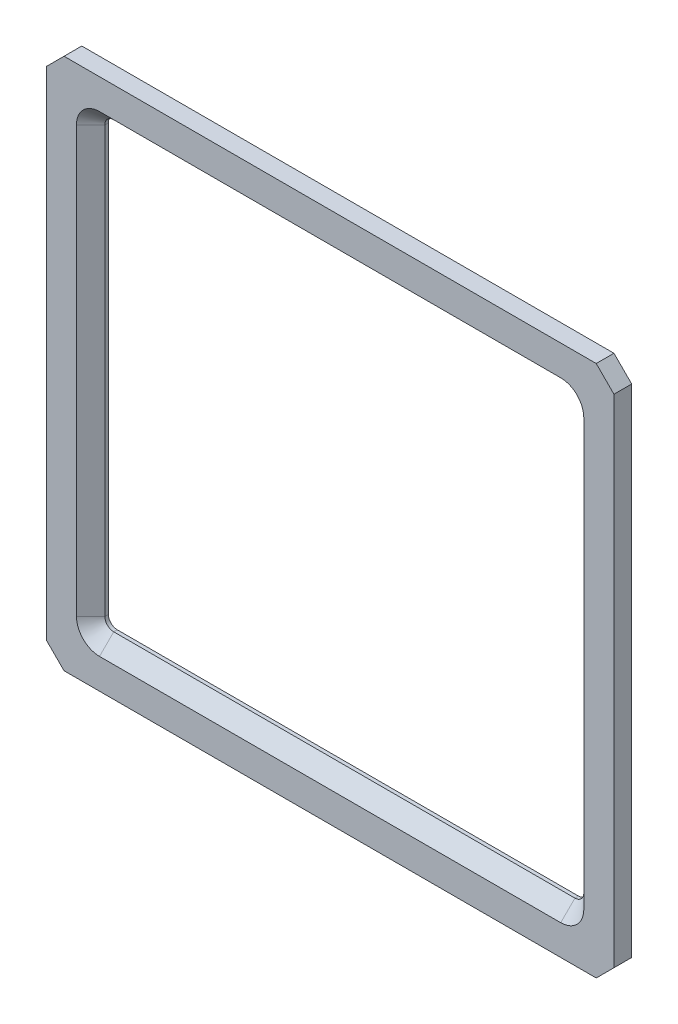
ISO-10303-21;
HEADER;
FILE_DESCRIPTION(('STEP AP214'),'2;1');
FILE_NAME('part.step','',(''),(''),'','','');
FILE_SCHEMA(('AUTOMOTIVE_DESIGN { 1 0 10303 214 1 1 1 1 }'));
ENDSEC;
DATA;
#1=APPLICATION_CONTEXT('core data for automotive mechanical design processes');
#2=APPLICATION_PROTOCOL_DEFINITION('international standard','automotive_design',2000,#1);
#3=PRODUCT_CONTEXT('',#1,'mechanical');
#4=PRODUCT('Part','Part','',(#3));
#5=PRODUCT_RELATED_PRODUCT_CATEGORY('part','',(#4));
#6=PRODUCT_DEFINITION_FORMATION('','',#4);
#7=PRODUCT_DEFINITION_CONTEXT('part definition',#1,'design');
#8=PRODUCT_DEFINITION('design','',#6,#7);
#9=PRODUCT_DEFINITION_SHAPE('','',#8);
#10=(LENGTH_UNIT() NAMED_UNIT(*) SI_UNIT(.MILLI.,.METRE.));
#11=(NAMED_UNIT(*) PLANE_ANGLE_UNIT() SI_UNIT($,.RADIAN.));
#12=(NAMED_UNIT(*) SI_UNIT($,.STERADIAN.) SOLID_ANGLE_UNIT());
#13=UNCERTAINTY_MEASURE_WITH_UNIT(LENGTH_MEASURE(1.E-05),#10,'distance_accuracy_value','');
#14=(GEOMETRIC_REPRESENTATION_CONTEXT(3) GLOBAL_UNCERTAINTY_ASSIGNED_CONTEXT((#13)) GLOBAL_UNIT_ASSIGNED_CONTEXT((#10,
#11,#12)) REPRESENTATION_CONTEXT('',''));
#15=CARTESIAN_POINT('',(0.,0.,0.));
#16=DIRECTION('',(0.,0.,1.));
#17=DIRECTION('',(1.,0.,0.));
#18=AXIS2_PLACEMENT_3D('',#15,#16,#17);
#19=CARTESIAN_POINT('',(160.,150.,10.));
#20=DIRECTION('',(-1.,0.,0.));
#21=DIRECTION('',(0.,-1.,0.));
#22=AXIS2_PLACEMENT_3D('',#19,#20,#21);
#23=PLANE('',#22);
#24=DIRECTION('',(0.,1.,0.));
#25=VECTOR('',#24,1.);
#26=CARTESIAN_POINT('',(160.,150.,10.));
#27=LINE('',#26,#25);
#28=CARTESIAN_POINT('',(160.,-140.,10.));
#29=VERTEX_POINT('',#28);
#30=CARTESIAN_POINT('',(160.,140.,10.));
#31=VERTEX_POINT('',#30);
#32=EDGE_CURVE('E221',#29,#31,#27,.T.);
#33=ORIENTED_EDGE('',*,*,#32,.F.);
#34=DIRECTION('',(0.,0.,-1.));
#35=VECTOR('',#34,1.);
#36=CARTESIAN_POINT('',(160.,-140.,10.));
#37=LINE('',#36,#35);
#38=CARTESIAN_POINT('',(160.,-140.,0.));
#39=VERTEX_POINT('',#38);
#40=EDGE_CURVE('E272',#29,#39,#37,.T.);
#41=ORIENTED_EDGE('',*,*,#40,.T.);
#42=DIRECTION('',(0.,1.,0.));
#43=VECTOR('',#42,1.);
#44=CARTESIAN_POINT('',(160.,150.,0.));
#45=LINE('',#44,#43);
#46=CARTESIAN_POINT('',(160.,140.,0.));
#47=VERTEX_POINT('',#46);
#48=EDGE_CURVE('E194',#39,#47,#45,.T.);
#49=ORIENTED_EDGE('',*,*,#48,.T.);
#50=DIRECTION('',(0.,0.,1.));
#51=VECTOR('',#50,1.);
#52=CARTESIAN_POINT('',(160.,140.,10.));
#53=LINE('',#52,#51);
#54=EDGE_CURVE('E270',#47,#31,#53,.T.);
#55=ORIENTED_EDGE('',*,*,#54,.T.);
#56=EDGE_LOOP('',(#33,#41,#49,#55));
#57=FACE_BOUND('',#56,.T.);
#58=ADVANCED_FACE('F35',(#57),#23,.F.);
#59=CARTESIAN_POINT('',(-160.,150.,10.));
#60=DIRECTION('',(0.,-1.,0.));
#61=DIRECTION('',(0.,0.,-1.));
#62=AXIS2_PLACEMENT_3D('',#59,#60,#61);
#63=PLANE('',#62);
#64=DIRECTION('',(-1.,0.,0.));
#65=VECTOR('',#64,1.);
#66=CARTESIAN_POINT('',(-160.,150.,0.));
#67=LINE('',#66,#65);
#68=CARTESIAN_POINT('',(150.,150.,0.));
#69=VERTEX_POINT('',#68);
#70=CARTESIAN_POINT('',(-150.,150.,0.));
#71=VERTEX_POINT('',#70);
#72=EDGE_CURVE('E237',#69,#71,#67,.T.);
#73=ORIENTED_EDGE('',*,*,#72,.T.);
#74=DIRECTION('',(0.,0.,1.));
#75=VECTOR('',#74,1.);
#76=CARTESIAN_POINT('',(-150.,150.,10.));
#77=LINE('',#76,#75);
#78=CARTESIAN_POINT('',(-150.,150.,10.));
#79=VERTEX_POINT('',#78);
#80=EDGE_CURVE('E278',#71,#79,#77,.T.);
#81=ORIENTED_EDGE('',*,*,#80,.T.);
#82=DIRECTION('',(-1.,0.,0.));
#83=VECTOR('',#82,1.);
#84=CARTESIAN_POINT('',(-160.,150.,10.));
#85=LINE('',#84,#83);
#86=CARTESIAN_POINT('',(150.,150.,10.));
#87=VERTEX_POINT('',#86);
#88=EDGE_CURVE('E224',#87,#79,#85,.T.);
#89=ORIENTED_EDGE('',*,*,#88,.F.);
#90=DIRECTION('',(0.,0.,-1.));
#91=VECTOR('',#90,1.);
#92=CARTESIAN_POINT('',(150.,150.,10.));
#93=LINE('',#92,#91);
#94=EDGE_CURVE('E275',#87,#69,#93,.T.);
#95=ORIENTED_EDGE('',*,*,#94,.T.);
#96=EDGE_LOOP('',(#73,#81,#89,#95));
#97=FACE_BOUND('',#96,.T.);
#98=ADVANCED_FACE('F396',(#97),#63,.F.);
#99=CARTESIAN_POINT('',(-160.,150.,10.));
#100=DIRECTION('',(1.,0.,0.));
#101=DIRECTION('',(0.,0.,-1.));
#102=AXIS2_PLACEMENT_3D('',#99,#100,#101);
#103=PLANE('',#102);
#104=DIRECTION('',(0.,-1.,0.));
#105=VECTOR('',#104,1.);
#106=CARTESIAN_POINT('',(-160.,150.,0.));
#107=LINE('',#106,#105);
#108=CARTESIAN_POINT('',(-160.,140.,0.));
#109=VERTEX_POINT('',#108);
#110=CARTESIAN_POINT('',(-160.,-140.,0.));
#111=VERTEX_POINT('',#110);
#112=EDGE_CURVE('E240',#109,#111,#107,.T.);
#113=ORIENTED_EDGE('',*,*,#112,.T.);
#114=DIRECTION('',(0.,0.,1.));
#115=VECTOR('',#114,1.);
#116=CARTESIAN_POINT('',(-160.,-140.,10.));
#117=LINE('',#116,#115);
#118=CARTESIAN_POINT('',(-160.,-140.,10.));
#119=VERTEX_POINT('',#118);
#120=EDGE_CURVE('E260',#111,#119,#117,.T.);
#121=ORIENTED_EDGE('',*,*,#120,.T.);
#122=DIRECTION('',(0.,-1.,0.));
#123=VECTOR('',#122,1.);
#124=CARTESIAN_POINT('',(-160.,150.,10.));
#125=LINE('',#124,#123);
#126=CARTESIAN_POINT('',(-160.,140.,10.));
#127=VERTEX_POINT('',#126);
#128=EDGE_CURVE('E228',#127,#119,#125,.T.);
#129=ORIENTED_EDGE('',*,*,#128,.F.);
#130=DIRECTION('',(0.,0.,-1.));
#131=VECTOR('',#130,1.);
#132=CARTESIAN_POINT('',(-160.,140.,10.));
#133=LINE('',#132,#131);
#134=EDGE_CURVE('E257',#127,#109,#133,.T.);
#135=ORIENTED_EDGE('',*,*,#134,.T.);
#136=EDGE_LOOP('',(#113,#121,#129,#135));
#137=FACE_BOUND('',#136,.T.);
#138=ADVANCED_FACE('F402',(#137),#103,.F.);
#139=CARTESIAN_POINT('',(-160.,-150.,10.));
#140=DIRECTION('',(0.,1.,0.));
#141=DIRECTION('',(0.,0.,1.));
#142=AXIS2_PLACEMENT_3D('',#139,#140,#141);
#143=PLANE('',#142);
#144=DIRECTION('',(1.,0.,0.));
#145=VECTOR('',#144,1.);
#146=CARTESIAN_POINT('',(-160.,-150.,10.));
#147=LINE('',#146,#145);
#148=CARTESIAN_POINT('',(-150.,-150.,10.));
#149=VERTEX_POINT('',#148);
#150=CARTESIAN_POINT('',(150.,-150.,10.));
#151=VERTEX_POINT('',#150);
#152=EDGE_CURVE('E231',#149,#151,#147,.T.);
#153=ORIENTED_EDGE('',*,*,#152,.F.);
#154=DIRECTION('',(0.,0.,-1.));
#155=VECTOR('',#154,1.);
#156=CARTESIAN_POINT('',(-150.,-150.,10.));
#157=LINE('',#156,#155);
#158=CARTESIAN_POINT('',(-150.,-150.,0.));
#159=VERTEX_POINT('',#158);
#160=EDGE_CURVE('E246',#149,#159,#157,.T.);
#161=ORIENTED_EDGE('',*,*,#160,.T.);
#162=DIRECTION('',(1.,0.,0.));
#163=VECTOR('',#162,1.);
#164=CARTESIAN_POINT('',(-160.,-150.,0.));
#165=LINE('',#164,#163);
#166=CARTESIAN_POINT('',(150.,-150.,0.));
#167=VERTEX_POINT('',#166);
#168=EDGE_CURVE('E225',#159,#167,#165,.T.);
#169=ORIENTED_EDGE('',*,*,#168,.T.);
#170=DIRECTION('',(0.,0.,1.));
#171=VECTOR('',#170,1.);
#172=CARTESIAN_POINT('',(150.,-150.,10.));
#173=LINE('',#172,#171);
#174=EDGE_CURVE('E234',#167,#151,#173,.T.);
#175=ORIENTED_EDGE('',*,*,#174,.T.);
#176=EDGE_LOOP('',(#153,#161,#169,#175));
#177=FACE_BOUND('',#176,.T.);
#178=ADVANCED_FACE('F567',(#177),#143,.F.);
#179=CARTESIAN_POINT('',(0.,0.,10.));
#180=DIRECTION('',(0.,0.,1.));
#181=DIRECTION('',(1.,0.,0.));
#182=AXIS2_PLACEMENT_3D('',#179,#180,#181);
#183=PLANE('',#182);
#184=CARTESIAN_POINT('',(130.,-120.,10.));
#185=DIRECTION('',(0.,0.,1.));
#186=DIRECTION('',(1.,0.,0.));
#187=AXIS2_PLACEMENT_3D('',#184,#185,#186);
#188=CIRCLE('',#187,13.0000000000001);
#189=CARTESIAN_POINT('',(143.,-120.,10.));
#190=VERTEX_POINT('',#189);
#191=CARTESIAN_POINT('',(130.,-133.,10.));
#192=VERTEX_POINT('',#191);
#193=EDGE_CURVE('E294',#190,#192,#188,.F.);
#194=ORIENTED_EDGE('',*,*,#193,.T.);
#195=DIRECTION('',(-1.,0.,0.));
#196=VECTOR('',#195,1.);
#197=CARTESIAN_POINT('',(-130.,-133.,10.));
#198=LINE('',#197,#196);
#199=CARTESIAN_POINT('',(-130.,-133.,10.));
#200=VERTEX_POINT('',#199);
#201=EDGE_CURVE('E296',#192,#200,#198,.T.);
#202=ORIENTED_EDGE('',*,*,#201,.T.);
#203=CARTESIAN_POINT('',(-130.,-120.,10.));
#204=DIRECTION('',(0.,0.,1.));
#205=DIRECTION('',(1.,0.,0.));
#206=AXIS2_PLACEMENT_3D('',#203,#204,#205);
#207=CIRCLE('',#206,13.0000000000001);
#208=CARTESIAN_POINT('',(-143.,-120.,10.));
#209=VERTEX_POINT('',#208);
#210=EDGE_CURVE('E292',#200,#209,#207,.F.);
#211=ORIENTED_EDGE('',*,*,#210,.T.);
#212=DIRECTION('',(0.,1.,0.));
#213=VECTOR('',#212,1.);
#214=CARTESIAN_POINT('',(-143.,120.,10.));
#215=LINE('',#214,#213);
#216=CARTESIAN_POINT('',(-143.,120.,10.));
#217=VERTEX_POINT('',#216);
#218=EDGE_CURVE('E288',#209,#217,#215,.T.);
#219=ORIENTED_EDGE('',*,*,#218,.T.);
#220=CARTESIAN_POINT('',(-130.,120.,10.));
#221=DIRECTION('',(0.,0.,1.));
#222=DIRECTION('',(1.,0.,0.));
#223=AXIS2_PLACEMENT_3D('',#220,#221,#222);
#224=CIRCLE('',#223,13.0000000000001);
#225=CARTESIAN_POINT('',(-130.,133.,10.));
#226=VERTEX_POINT('',#225);
#227=EDGE_CURVE('E284',#217,#226,#224,.F.);
#228=ORIENTED_EDGE('',*,*,#227,.T.);
#229=DIRECTION('',(1.,0.,0.));
#230=VECTOR('',#229,1.);
#231=CARTESIAN_POINT('',(130.,133.,10.));
#232=LINE('',#231,#230);
#233=CARTESIAN_POINT('',(130.,133.,10.));
#234=VERTEX_POINT('',#233);
#235=EDGE_CURVE('E282',#226,#234,#232,.T.);
#236=ORIENTED_EDGE('',*,*,#235,.T.);
#237=CARTESIAN_POINT('',(130.,120.,10.));
#238=DIRECTION('',(0.,0.,1.));
#239=DIRECTION('',(1.,0.,0.));
#240=AXIS2_PLACEMENT_3D('',#237,#238,#239);
#241=CIRCLE('',#240,13.0000000000002);
#242=CARTESIAN_POINT('',(143.,120.,10.));
#243=VERTEX_POINT('',#242);
#244=EDGE_CURVE('E286',#234,#243,#241,.F.);
#245=ORIENTED_EDGE('',*,*,#244,.T.);
#246=DIRECTION('',(0.,-1.,0.));
#247=VECTOR('',#246,1.);
#248=CARTESIAN_POINT('',(143.,-120.,10.));
#249=LINE('',#248,#247);
#250=EDGE_CURVE('E290',#243,#190,#249,.T.);
#251=ORIENTED_EDGE('',*,*,#250,.T.);
#252=EDGE_LOOP('',(#194,#202,#211,#219,#228,#236,#245,#251));
#253=FACE_BOUND('',#252,.T.);
#254=ORIENTED_EDGE('',*,*,#128,.T.);
#255=DIRECTION('',(-0.707106781186547,0.707106781186548,0.));
#256=VECTOR('',#255,1.);
#257=CARTESIAN_POINT('',(-150.,-150.,10.));
#258=LINE('',#257,#256);
#259=EDGE_CURVE('E268',#119,#149,#258,.F.);
#260=ORIENTED_EDGE('',*,*,#259,.T.);
#261=ORIENTED_EDGE('',*,*,#152,.T.);
#262=DIRECTION('',(-0.707106781186549,-0.707106781186547,0.));
#263=VECTOR('',#262,1.);
#264=CARTESIAN_POINT('',(150.,-150.,10.));
#265=LINE('',#264,#263);
#266=EDGE_CURVE('E266',#151,#29,#265,.F.);
#267=ORIENTED_EDGE('',*,*,#266,.T.);
#268=ORIENTED_EDGE('',*,*,#32,.T.);
#269=DIRECTION('',(0.707106781186546,-0.707106781186549,0.));
#270=VECTOR('',#269,1.);
#271=CARTESIAN_POINT('',(150.,150.,10.));
#272=LINE('',#271,#270);
#273=EDGE_CURVE('E262',#31,#87,#272,.F.);
#274=ORIENTED_EDGE('',*,*,#273,.T.);
#275=ORIENTED_EDGE('',*,*,#88,.T.);
#276=DIRECTION('',(0.707106781186549,0.707106781186546,0.));
#277=VECTOR('',#276,1.);
#278=CARTESIAN_POINT('',(-150.,150.,10.));
#279=LINE('',#278,#277);
#280=EDGE_CURVE('E264',#79,#127,#279,.F.);
#281=ORIENTED_EDGE('',*,*,#280,.T.);
#282=EDGE_LOOP('',(#254,#260,#261,#267,#268,#274,#275,#281));
#283=FACE_BOUND('',#282,.T.);
#284=ADVANCED_FACE('F385',(#253,#283),#183,.T.);
#285=CARTESIAN_POINT('',(0.,0.,0.));
#286=DIRECTION('',(0.,0.,1.));
#287=DIRECTION('',(1.,0.,0.));
#288=AXIS2_PLACEMENT_3D('',#285,#286,#287);
#289=PLANE('',#288);
#290=DIRECTION('',(0.,1.,0.));
#291=VECTOR('',#290,1.);
#292=CARTESIAN_POINT('',(-135.,120.,0.));
#293=LINE('',#292,#291);
#294=CARTESIAN_POINT('',(-135.,-120.,0.));
#295=VERTEX_POINT('',#294);
#296=CARTESIAN_POINT('',(-135.,120.,0.));
#297=VERTEX_POINT('',#296);
#298=EDGE_CURVE('E201',#295,#297,#293,.T.);
#299=ORIENTED_EDGE('',*,*,#298,.F.);
#300=CARTESIAN_POINT('',(-130.,-120.,0.));
#301=DIRECTION('',(0.,0.,1.));
#302=DIRECTION('',(1.,0.,0.));
#303=AXIS2_PLACEMENT_3D('',#300,#301,#302);
#304=CIRCLE('',#303,5.);
#305=CARTESIAN_POINT('',(-130.,-125.,0.));
#306=VERTEX_POINT('',#305);
#307=EDGE_CURVE('E178',#306,#295,#304,.F.);
#308=ORIENTED_EDGE('',*,*,#307,.F.);
#309=DIRECTION('',(-1.,0.,0.));
#310=VECTOR('',#309,1.);
#311=CARTESIAN_POINT('',(-130.,-125.,0.));
#312=LINE('',#311,#310);
#313=CARTESIAN_POINT('',(130.,-125.,0.));
#314=VERTEX_POINT('',#313);
#315=EDGE_CURVE('E189',#314,#306,#312,.T.);
#316=ORIENTED_EDGE('',*,*,#315,.F.);
#317=CARTESIAN_POINT('',(130.,-120.,0.));
#318=DIRECTION('',(0.,0.,1.));
#319=DIRECTION('',(1.,0.,0.));
#320=AXIS2_PLACEMENT_3D('',#317,#318,#319);
#321=CIRCLE('',#320,5.);
#322=CARTESIAN_POINT('',(135.,-120.,0.));
#323=VERTEX_POINT('',#322);
#324=EDGE_CURVE('E329',#323,#314,#321,.F.);
#325=ORIENTED_EDGE('',*,*,#324,.F.);
#326=DIRECTION('',(0.,-1.,0.));
#327=VECTOR('',#326,1.);
#328=CARTESIAN_POINT('',(135.,120.,0.));
#329=LINE('',#328,#327);
#330=CARTESIAN_POINT('',(135.,120.,0.));
#331=VERTEX_POINT('',#330);
#332=EDGE_CURVE('E334',#331,#323,#329,.T.);
#333=ORIENTED_EDGE('',*,*,#332,.F.);
#334=CARTESIAN_POINT('',(130.,120.,0.));
#335=DIRECTION('',(0.,0.,1.));
#336=DIRECTION('',(1.,0.,0.));
#337=AXIS2_PLACEMENT_3D('',#334,#335,#336);
#338=CIRCLE('',#337,5.);
#339=CARTESIAN_POINT('',(130.,125.,0.));
#340=VERTEX_POINT('',#339);
#341=EDGE_CURVE('E338',#340,#331,#338,.F.);
#342=ORIENTED_EDGE('',*,*,#341,.F.);
#343=DIRECTION('',(1.,0.,0.));
#344=VECTOR('',#343,1.);
#345=CARTESIAN_POINT('',(-130.,125.,0.));
#346=LINE('',#345,#344);
#347=CARTESIAN_POINT('',(-130.,125.,0.));
#348=VERTEX_POINT('',#347);
#349=EDGE_CURVE('E343',#348,#340,#346,.T.);
#350=ORIENTED_EDGE('',*,*,#349,.F.);
#351=CARTESIAN_POINT('',(-130.,120.,0.));
#352=DIRECTION('',(0.,0.,1.));
#353=DIRECTION('',(1.,0.,0.));
#354=AXIS2_PLACEMENT_3D('',#351,#352,#353);
#355=CIRCLE('',#354,5.);
#356=EDGE_CURVE('E203',#297,#348,#355,.F.);
#357=ORIENTED_EDGE('',*,*,#356,.F.);
#358=EDGE_LOOP('',(#299,#308,#316,#325,#333,#342,#350,#357));
#359=FACE_BOUND('',#358,.T.);
#360=ORIENTED_EDGE('',*,*,#168,.F.);
#361=DIRECTION('',(0.707106781186547,-0.707106781186548,0.));
#362=VECTOR('',#361,1.);
#363=CARTESIAN_POINT('',(-150.,-150.,0.));
#364=LINE('',#363,#362);
#365=EDGE_CURVE('E255',#159,#111,#364,.F.);
#366=ORIENTED_EDGE('',*,*,#365,.T.);
#367=ORIENTED_EDGE('',*,*,#112,.F.);
#368=DIRECTION('',(-0.707106781186549,-0.707106781186546,0.));
#369=VECTOR('',#368,1.);
#370=CARTESIAN_POINT('',(-160.,140.,0.));
#371=LINE('',#370,#369);
#372=EDGE_CURVE('E251',#109,#71,#371,.F.);
#373=ORIENTED_EDGE('',*,*,#372,.T.);
#374=ORIENTED_EDGE('',*,*,#72,.F.);
#375=DIRECTION('',(-0.707106781186546,0.707106781186549,0.));
#376=VECTOR('',#375,1.);
#377=CARTESIAN_POINT('',(150.,150.,0.));
#378=LINE('',#377,#376);
#379=EDGE_CURVE('E249',#69,#47,#378,.F.);
#380=ORIENTED_EDGE('',*,*,#379,.T.);
#381=ORIENTED_EDGE('',*,*,#48,.F.);
#382=DIRECTION('',(0.707106781186549,0.707106781186547,0.));
#383=VECTOR('',#382,1.);
#384=CARTESIAN_POINT('',(160.,-140.,0.));
#385=LINE('',#384,#383);
#386=EDGE_CURVE('E253',#39,#167,#385,.F.);
#387=ORIENTED_EDGE('',*,*,#386,.T.);
#388=EDGE_LOOP('',(#360,#366,#367,#373,#374,#380,#381,#387));
#389=FACE_BOUND('',#388,.T.);
#390=ADVANCED_FACE('F197',(#359,#389),#289,.F.);
#391=CARTESIAN_POINT('',(-150.,-150.,10.));
#392=DIRECTION('',(0.707106781186548,0.707106781186547,0.));
#393=DIRECTION('',(0.,0.,-1.));
#394=AXIS2_PLACEMENT_3D('',#391,#392,#393);
#395=PLANE('',#394);
#396=ORIENTED_EDGE('',*,*,#259,.F.);
#397=ORIENTED_EDGE('',*,*,#120,.F.);
#398=ORIENTED_EDGE('',*,*,#365,.F.);
#399=ORIENTED_EDGE('',*,*,#160,.F.);
#400=EDGE_LOOP('',(#396,#397,#398,#399));
#401=FACE_BOUND('',#400,.T.);
#402=ADVANCED_FACE('F408',(#401),#395,.F.);
#403=CARTESIAN_POINT('',(160.,-140.,10.));
#404=DIRECTION('',(-0.707106781186546,0.707106781186548,0.));
#405=DIRECTION('',(0.,0.,-1.));
#406=AXIS2_PLACEMENT_3D('',#403,#404,#405);
#407=PLANE('',#406);
#408=ORIENTED_EDGE('',*,*,#266,.F.);
#409=ORIENTED_EDGE('',*,*,#174,.F.);
#410=ORIENTED_EDGE('',*,*,#386,.F.);
#411=ORIENTED_EDGE('',*,*,#40,.F.);
#412=EDGE_LOOP('',(#408,#409,#410,#411));
#413=FACE_BOUND('',#412,.T.);
#414=ADVANCED_FACE('F411',(#413),#407,.F.);
#415=CARTESIAN_POINT('',(-160.,140.,10.));
#416=DIRECTION('',(0.707106781186546,-0.707106781186549,0.));
#417=DIRECTION('',(0.,0.,-1.));
#418=AXIS2_PLACEMENT_3D('',#415,#416,#417);
#419=PLANE('',#418);
#420=ORIENTED_EDGE('',*,*,#280,.F.);
#421=ORIENTED_EDGE('',*,*,#80,.F.);
#422=ORIENTED_EDGE('',*,*,#372,.F.);
#423=ORIENTED_EDGE('',*,*,#134,.F.);
#424=EDGE_LOOP('',(#420,#421,#422,#423));
#425=FACE_BOUND('',#424,.T.);
#426=ADVANCED_FACE('F415',(#425),#419,.F.);
#427=CARTESIAN_POINT('',(150.,150.,10.));
#428=DIRECTION('',(-0.707106781186549,-0.707106781186545,0.));
#429=DIRECTION('',(0.,0.,-1.));
#430=AXIS2_PLACEMENT_3D('',#427,#428,#429);
#431=PLANE('',#430);
#432=ORIENTED_EDGE('',*,*,#273,.F.);
#433=ORIENTED_EDGE('',*,*,#54,.F.);
#434=ORIENTED_EDGE('',*,*,#379,.F.);
#435=ORIENTED_EDGE('',*,*,#94,.F.);
#436=EDGE_LOOP('',(#432,#433,#434,#435));
#437=FACE_BOUND('',#436,.T.);
#438=ADVANCED_FACE('F419',(#437),#431,.F.);
#439=CARTESIAN_POINT('',(-130.,-120.,-0.000999999999999265));
#440=DIRECTION('',(0.,0.,1.));
#441=DIRECTION('',(1.,0.,0.));
#442=AXIS2_PLACEMENT_3D('',#439,#440,#441);
#443=CYLINDRICAL_SURFACE('',#442,5.);
#444=DIRECTION('',(0.,0.,1.));
#445=VECTOR('',#444,1.);
#446=CARTESIAN_POINT('',(-135.,-120.,-0.000999999999999265));
#447=LINE('',#446,#445);
#448=CARTESIAN_POINT('',(-135.,-120.,1.99999999999994));
#449=VERTEX_POINT('',#448);
#450=EDGE_CURVE('E195',#295,#449,#447,.T.);
#451=ORIENTED_EDGE('',*,*,#450,.T.);
#452=CARTESIAN_POINT('',(-130.,-120.,1.99999999999994));
#453=DIRECTION('',(0.,0.,1.));
#454=DIRECTION('',(1.,0.,0.));
#455=AXIS2_PLACEMENT_3D('',#452,#453,#454);
#456=CIRCLE('',#455,5.);
#457=CARTESIAN_POINT('',(-130.,-125.,1.99999999999994));
#458=VERTEX_POINT('',#457);
#459=EDGE_CURVE('E181',#449,#458,#456,.T.);
#460=ORIENTED_EDGE('',*,*,#459,.T.);
#461=DIRECTION('',(0.,0.,1.));
#462=VECTOR('',#461,1.);
#463=CARTESIAN_POINT('',(-130.,-125.,-0.000999999999999265));
#464=LINE('',#463,#462);
#465=EDGE_CURVE('E173',#306,#458,#464,.T.);
#466=ORIENTED_EDGE('',*,*,#465,.F.);
#467=ORIENTED_EDGE('',*,*,#307,.T.);
#468=EDGE_LOOP('',(#451,#460,#466,#467));
#469=FACE_BOUND('',#468,.T.);
#470=ADVANCED_FACE('F176',(#469),#443,.F.);
#471=CARTESIAN_POINT('',(-135.,120.,-0.000999999999999265));
#472=DIRECTION('',(-1.,0.,0.));
#473=DIRECTION('',(0.,-1.,0.));
#474=AXIS2_PLACEMENT_3D('',#471,#472,#473);
#475=PLANE('',#474);
#476=DIRECTION('',(0.,0.,1.));
#477=VECTOR('',#476,1.);
#478=CARTESIAN_POINT('',(-135.,120.,-0.000999999999999265));
#479=LINE('',#478,#477);
#480=CARTESIAN_POINT('',(-135.,120.,1.99999999999994));
#481=VERTEX_POINT('',#480);
#482=EDGE_CURVE('E208',#297,#481,#479,.T.);
#483=ORIENTED_EDGE('',*,*,#482,.T.);
#484=DIRECTION('',(0.,-1.,0.));
#485=VECTOR('',#484,1.);
#486=CARTESIAN_POINT('',(-135.,-120.,1.99999999999994));
#487=LINE('',#486,#485);
#488=EDGE_CURVE('E304',#481,#449,#487,.T.);
#489=ORIENTED_EDGE('',*,*,#488,.T.);
#490=ORIENTED_EDGE('',*,*,#450,.F.);
#491=ORIENTED_EDGE('',*,*,#298,.T.);
#492=EDGE_LOOP('',(#483,#489,#490,#491));
#493=FACE_BOUND('',#492,.T.);
#494=ADVANCED_FACE('F358',(#493),#475,.F.);
#495=CARTESIAN_POINT('',(-130.,120.,-0.000999999999999265));
#496=DIRECTION('',(0.,0.,1.));
#497=DIRECTION('',(1.,0.,0.));
#498=AXIS2_PLACEMENT_3D('',#495,#496,#497);
#499=CYLINDRICAL_SURFACE('',#498,5.);
#500=DIRECTION('',(0.,0.,1.));
#501=VECTOR('',#500,1.);
#502=CARTESIAN_POINT('',(-130.,125.,-0.000999999999999265));
#503=LINE('',#502,#501);
#504=CARTESIAN_POINT('',(-130.,125.,1.99999999999994));
#505=VERTEX_POINT('',#504);
#506=EDGE_CURVE('E211',#348,#505,#503,.T.);
#507=ORIENTED_EDGE('',*,*,#506,.T.);
#508=CARTESIAN_POINT('',(-130.,120.,1.99999999999994));
#509=DIRECTION('',(0.,0.,1.));
#510=DIRECTION('',(1.,0.,0.));
#511=AXIS2_PLACEMENT_3D('',#508,#509,#510);
#512=CIRCLE('',#511,5.);
#513=EDGE_CURVE('E44',#505,#481,#512,.T.);
#514=ORIENTED_EDGE('',*,*,#513,.T.);
#515=ORIENTED_EDGE('',*,*,#482,.F.);
#516=ORIENTED_EDGE('',*,*,#356,.T.);
#517=EDGE_LOOP('',(#507,#514,#515,#516));
#518=FACE_BOUND('',#517,.T.);
#519=ADVANCED_FACE('F348',(#518),#499,.F.);
#520=CARTESIAN_POINT('',(-130.,125.,-0.000999999999999265));
#521=DIRECTION('',(0.,1.,0.));
#522=DIRECTION('',(0.,0.,1.));
#523=AXIS2_PLACEMENT_3D('',#520,#521,#522);
#524=PLANE('',#523);
#525=DIRECTION('',(0.,0.,1.));
#526=VECTOR('',#525,1.);
#527=CARTESIAN_POINT('',(130.,125.,-0.000999999999999265));
#528=LINE('',#527,#526);
#529=CARTESIAN_POINT('',(130.,125.,1.99999999999994));
#530=VERTEX_POINT('',#529);
#531=EDGE_CURVE('E213',#340,#530,#528,.T.);
#532=ORIENTED_EDGE('',*,*,#531,.T.);
#533=DIRECTION('',(-1.,0.,0.));
#534=VECTOR('',#533,1.);
#535=CARTESIAN_POINT('',(-130.,125.,1.99999999999994));
#536=LINE('',#535,#534);
#537=EDGE_CURVE('E11',#530,#505,#536,.T.);
#538=ORIENTED_EDGE('',*,*,#537,.T.);
#539=ORIENTED_EDGE('',*,*,#506,.F.);
#540=ORIENTED_EDGE('',*,*,#349,.T.);
#541=EDGE_LOOP('',(#532,#538,#539,#540));
#542=FACE_BOUND('',#541,.T.);
#543=ADVANCED_FACE('F351',(#542),#524,.F.);
#544=CARTESIAN_POINT('',(130.,120.,-0.000999999999999265));
#545=DIRECTION('',(0.,0.,1.));
#546=DIRECTION('',(1.,0.,0.));
#547=AXIS2_PLACEMENT_3D('',#544,#545,#546);
#548=CYLINDRICAL_SURFACE('',#547,5.);
#549=DIRECTION('',(0.,0.,1.));
#550=VECTOR('',#549,1.);
#551=CARTESIAN_POINT('',(135.,120.,-0.000999999999999265));
#552=LINE('',#551,#550);
#553=CARTESIAN_POINT('',(135.,120.,1.99999999999994));
#554=VERTEX_POINT('',#553);
#555=EDGE_CURVE('E215',#331,#554,#552,.T.);
#556=ORIENTED_EDGE('',*,*,#555,.T.);
#557=CARTESIAN_POINT('',(130.,120.,1.99999999999994));
#558=DIRECTION('',(0.,0.,1.));
#559=DIRECTION('',(1.,0.,0.));
#560=AXIS2_PLACEMENT_3D('',#557,#558,#559);
#561=CIRCLE('',#560,5.);
#562=EDGE_CURVE('E58',#554,#530,#561,.T.);
#563=ORIENTED_EDGE('',*,*,#562,.T.);
#564=ORIENTED_EDGE('',*,*,#531,.F.);
#565=ORIENTED_EDGE('',*,*,#341,.T.);
#566=EDGE_LOOP('',(#556,#563,#564,#565));
#567=FACE_BOUND('',#566,.T.);
#568=ADVANCED_FACE('F496',(#567),#548,.F.);
#569=CARTESIAN_POINT('',(135.,120.,-0.000999999999999265));
#570=DIRECTION('',(1.,0.,0.));
#571=DIRECTION('',(0.,1.,0.));
#572=AXIS2_PLACEMENT_3D('',#569,#570,#571);
#573=PLANE('',#572);
#574=DIRECTION('',(0.,0.,1.));
#575=VECTOR('',#574,1.);
#576=CARTESIAN_POINT('',(135.,-120.,-0.000999999999999265));
#577=LINE('',#576,#575);
#578=CARTESIAN_POINT('',(135.,-120.,1.99999999999994));
#579=VERTEX_POINT('',#578);
#580=EDGE_CURVE('E217',#323,#579,#577,.T.);
#581=ORIENTED_EDGE('',*,*,#580,.T.);
#582=DIRECTION('',(0.,1.,0.));
#583=VECTOR('',#582,1.);
#584=CARTESIAN_POINT('',(135.,120.,1.99999999999994));
#585=LINE('',#584,#583);
#586=EDGE_CURVE('E302',#579,#554,#585,.T.);
#587=ORIENTED_EDGE('',*,*,#586,.T.);
#588=ORIENTED_EDGE('',*,*,#555,.F.);
#589=ORIENTED_EDGE('',*,*,#332,.T.);
#590=EDGE_LOOP('',(#581,#587,#588,#589));
#591=FACE_BOUND('',#590,.T.);
#592=ADVANCED_FACE('F376',(#591),#573,.F.);
#593=CARTESIAN_POINT('',(130.,-120.,-0.000999999999999265));
#594=DIRECTION('',(0.,0.,1.));
#595=DIRECTION('',(1.,0.,0.));
#596=AXIS2_PLACEMENT_3D('',#593,#594,#595);
#597=CYLINDRICAL_SURFACE('',#596,5.);
#598=DIRECTION('',(0.,0.,1.));
#599=VECTOR('',#598,1.);
#600=CARTESIAN_POINT('',(130.,-125.,-0.000999999999999265));
#601=LINE('',#600,#599);
#602=CARTESIAN_POINT('',(130.,-125.,1.99999999999994));
#603=VERTEX_POINT('',#602);
#604=EDGE_CURVE('E185',#314,#603,#601,.T.);
#605=ORIENTED_EDGE('',*,*,#604,.T.);
#606=CARTESIAN_POINT('',(130.,-120.,1.99999999999994));
#607=DIRECTION('',(0.,0.,1.));
#608=DIRECTION('',(1.,0.,0.));
#609=AXIS2_PLACEMENT_3D('',#606,#607,#608);
#610=CIRCLE('',#609,5.);
#611=EDGE_CURVE('E299',#603,#579,#610,.T.);
#612=ORIENTED_EDGE('',*,*,#611,.T.);
#613=ORIENTED_EDGE('',*,*,#580,.F.);
#614=ORIENTED_EDGE('',*,*,#324,.T.);
#615=EDGE_LOOP('',(#605,#612,#613,#614));
#616=FACE_BOUND('',#615,.T.);
#617=ADVANCED_FACE('F372',(#616),#597,.F.);
#618=CARTESIAN_POINT('',(-130.,-125.,-0.000999999999999265));
#619=DIRECTION('',(0.,-1.,0.));
#620=DIRECTION('',(0.,0.,-1.));
#621=AXIS2_PLACEMENT_3D('',#618,#619,#620);
#622=PLANE('',#621);
#623=ORIENTED_EDGE('',*,*,#465,.T.);
#624=DIRECTION('',(1.,0.,0.));
#625=VECTOR('',#624,1.);
#626=CARTESIAN_POINT('',(130.,-125.,1.99999999999994));
#627=LINE('',#626,#625);
#628=EDGE_CURVE('E280',#458,#603,#627,.T.);
#629=ORIENTED_EDGE('',*,*,#628,.T.);
#630=ORIENTED_EDGE('',*,*,#604,.F.);
#631=ORIENTED_EDGE('',*,*,#315,.T.);
#632=EDGE_LOOP('',(#623,#629,#630,#631));
#633=FACE_BOUND('',#632,.T.);
#634=ADVANCED_FACE('F190',(#633),#622,.F.);
#635=CARTESIAN_POINT('',(-130.,125.,1.99999999999994));
#636=DIRECTION('',(0.,-0.707106781186545,0.707106781186551));
#637=DIRECTION('',(1.,0.,0.));
#638=AXIS2_PLACEMENT_3D('',#635,#636,#637);
#639=PLANE('',#638);
#640=DIRECTION('',(0.,-0.707106781186551,-0.707106781186545));
#641=VECTOR('',#640,1.);
#642=CARTESIAN_POINT('',(130.,133.,10.));
#643=LINE('',#642,#641);
#644=EDGE_CURVE('E323',#234,#530,#643,.T.);
#645=ORIENTED_EDGE('',*,*,#644,.F.);
#646=ORIENTED_EDGE('',*,*,#235,.F.);
#647=DIRECTION('',(0.,0.707106781186551,0.707106781186545));
#648=VECTOR('',#647,1.);
#649=CARTESIAN_POINT('',(-130.,125.,1.99999999999994));
#650=LINE('',#649,#648);
#651=EDGE_CURVE('E39',#505,#226,#650,.T.);
#652=ORIENTED_EDGE('',*,*,#651,.F.);
#653=ORIENTED_EDGE('',*,*,#537,.F.);
#654=EDGE_LOOP('',(#645,#646,#652,#653));
#655=FACE_BOUND('',#654,.T.);
#656=ADVANCED_FACE('F37',(#655),#639,.T.);
#657=CARTESIAN_POINT('',(-130.,120.,1.99999999999994));
#658=DIRECTION('',(0.,0.,1.));
#659=DIRECTION('',(1.,0.,0.));
#660=AXIS2_PLACEMENT_3D('',#657,#658,#659);
#661=CONICAL_SURFACE('',#660,5.,0.785398163397452);
#662=ORIENTED_EDGE('',*,*,#651,.T.);
#663=ORIENTED_EDGE('',*,*,#227,.F.);
#664=DIRECTION('',(-0.70710678118655,0.,0.707106781186545));
#665=VECTOR('',#664,1.);
#666=CARTESIAN_POINT('',(-135.,120.,1.99999999999994));
#667=LINE('',#666,#665);
#668=EDGE_CURVE('E321',#481,#217,#667,.T.);
#669=ORIENTED_EDGE('',*,*,#668,.F.);
#670=ORIENTED_EDGE('',*,*,#513,.F.);
#671=EDGE_LOOP('',(#662,#663,#669,#670));
#672=FACE_BOUND('',#671,.T.);
#673=ADVANCED_FACE('F355',(#672),#661,.F.);
#674=CARTESIAN_POINT('',(130.,120.,1.99999999999994));
#675=DIRECTION('',(0.,0.,1.));
#676=DIRECTION('',(1.,0.,0.));
#677=AXIS2_PLACEMENT_3D('',#674,#675,#676);
#678=CONICAL_SURFACE('',#677,5.,0.785398163397453);
#679=ORIENTED_EDGE('',*,*,#644,.T.);
#680=ORIENTED_EDGE('',*,*,#562,.F.);
#681=DIRECTION('',(-0.707106781186551,0.,-0.707106781186544));
#682=VECTOR('',#681,1.);
#683=CARTESIAN_POINT('',(143.,120.,10.));
#684=LINE('',#683,#682);
#685=EDGE_CURVE('E318',#243,#554,#684,.T.);
#686=ORIENTED_EDGE('',*,*,#685,.F.);
#687=ORIENTED_EDGE('',*,*,#244,.F.);
#688=EDGE_LOOP('',(#679,#680,#686,#687));
#689=FACE_BOUND('',#688,.T.);
#690=ADVANCED_FACE('F387',(#689),#678,.F.);
#691=CARTESIAN_POINT('',(-135.,120.,1.99999999999994));
#692=DIRECTION('',(0.707106781186545,0.,0.707106781186551));
#693=DIRECTION('',(0.,1.,0.));
#694=AXIS2_PLACEMENT_3D('',#691,#692,#693);
#695=PLANE('',#694);
#696=ORIENTED_EDGE('',*,*,#668,.T.);
#697=ORIENTED_EDGE('',*,*,#218,.F.);
#698=DIRECTION('',(-0.70710678118655,0.,0.707106781186545));
#699=VECTOR('',#698,1.);
#700=CARTESIAN_POINT('',(-135.,-120.,1.99999999999994));
#701=LINE('',#700,#699);
#702=EDGE_CURVE('E315',#449,#209,#701,.T.);
#703=ORIENTED_EDGE('',*,*,#702,.F.);
#704=ORIENTED_EDGE('',*,*,#488,.F.);
#705=EDGE_LOOP('',(#696,#697,#703,#704));
#706=FACE_BOUND('',#705,.T.);
#707=ADVANCED_FACE('F362',(#706),#695,.T.);
#708=CARTESIAN_POINT('',(135.,120.,1.99999999999994));
#709=DIRECTION('',(-0.707106781186545,0.,0.70710678118655));
#710=DIRECTION('',(0.,-1.,0.));
#711=AXIS2_PLACEMENT_3D('',#708,#709,#710);
#712=PLANE('',#711);
#713=ORIENTED_EDGE('',*,*,#685,.T.);
#714=ORIENTED_EDGE('',*,*,#586,.F.);
#715=DIRECTION('',(-0.70710678118655,0.,-0.707106781186545));
#716=VECTOR('',#715,1.);
#717=CARTESIAN_POINT('',(143.,-120.,10.));
#718=LINE('',#717,#716);
#719=EDGE_CURVE('E312',#190,#579,#718,.T.);
#720=ORIENTED_EDGE('',*,*,#719,.F.);
#721=ORIENTED_EDGE('',*,*,#250,.F.);
#722=EDGE_LOOP('',(#713,#714,#720,#721));
#723=FACE_BOUND('',#722,.T.);
#724=ADVANCED_FACE('F379',(#723),#712,.T.);
#725=CARTESIAN_POINT('',(-130.,-120.,1.99999999999994));
#726=DIRECTION('',(0.,0.,1.));
#727=DIRECTION('',(1.,0.,0.));
#728=AXIS2_PLACEMENT_3D('',#725,#726,#727);
#729=CONICAL_SURFACE('',#728,5.,0.785398163397452);
#730=ORIENTED_EDGE('',*,*,#702,.T.);
#731=ORIENTED_EDGE('',*,*,#210,.F.);
#732=DIRECTION('',(0.,-0.70710678118655,0.707106781186545));
#733=VECTOR('',#732,1.);
#734=CARTESIAN_POINT('',(-130.,-125.,1.99999999999994));
#735=LINE('',#734,#733);
#736=EDGE_CURVE('E310',#458,#200,#735,.T.);
#737=ORIENTED_EDGE('',*,*,#736,.F.);
#738=ORIENTED_EDGE('',*,*,#459,.F.);
#739=EDGE_LOOP('',(#730,#731,#737,#738));
#740=FACE_BOUND('',#739,.T.);
#741=ADVANCED_FACE('F365',(#740),#729,.F.);
#742=CARTESIAN_POINT('',(130.,-120.,1.99999999999994));
#743=DIRECTION('',(0.,0.,1.));
#744=DIRECTION('',(1.,0.,0.));
#745=AXIS2_PLACEMENT_3D('',#742,#743,#744);
#746=CONICAL_SURFACE('',#745,5.,0.785398163397452);
#747=ORIENTED_EDGE('',*,*,#719,.T.);
#748=ORIENTED_EDGE('',*,*,#611,.F.);
#749=DIRECTION('',(0.,0.70710678118655,-0.707106781186545));
#750=VECTOR('',#749,1.);
#751=CARTESIAN_POINT('',(130.,-133.,10.));
#752=LINE('',#751,#750);
#753=EDGE_CURVE('E308',#192,#603,#752,.T.);
#754=ORIENTED_EDGE('',*,*,#753,.F.);
#755=ORIENTED_EDGE('',*,*,#193,.F.);
#756=EDGE_LOOP('',(#747,#748,#754,#755));
#757=FACE_BOUND('',#756,.T.);
#758=ADVANCED_FACE('F383',(#757),#746,.F.);
#759=CARTESIAN_POINT('',(-130.,-125.,1.99999999999994));
#760=DIRECTION('',(0.,0.707106781186545,0.70710678118655));
#761=DIRECTION('',(-1.,0.,0.));
#762=AXIS2_PLACEMENT_3D('',#759,#760,#761);
#763=PLANE('',#762);
#764=ORIENTED_EDGE('',*,*,#736,.T.);
#765=ORIENTED_EDGE('',*,*,#201,.F.);
#766=ORIENTED_EDGE('',*,*,#753,.T.);
#767=ORIENTED_EDGE('',*,*,#628,.F.);
#768=EDGE_LOOP('',(#764,#765,#766,#767));
#769=FACE_BOUND('',#768,.T.);
#770=ADVANCED_FACE('F369',(#769),#763,.T.);
#771=CLOSED_SHELL('',(#58,#98,#138,#178,#284,#390,#402,#414,#426,#438,#470,#494,#519,#543,#568,
#592,#617,#634,#656,#673,#690,#707,#724,#741,#758,#770));
#772=MANIFOLD_SOLID_BREP('B2',#771);
#773=ADVANCED_BREP_SHAPE_REPRESENTATION('',(#18,#772),#14);
#774=SHAPE_DEFINITION_REPRESENTATION(#9,#773);
ENDSEC;
END-ISO-10303-21;
